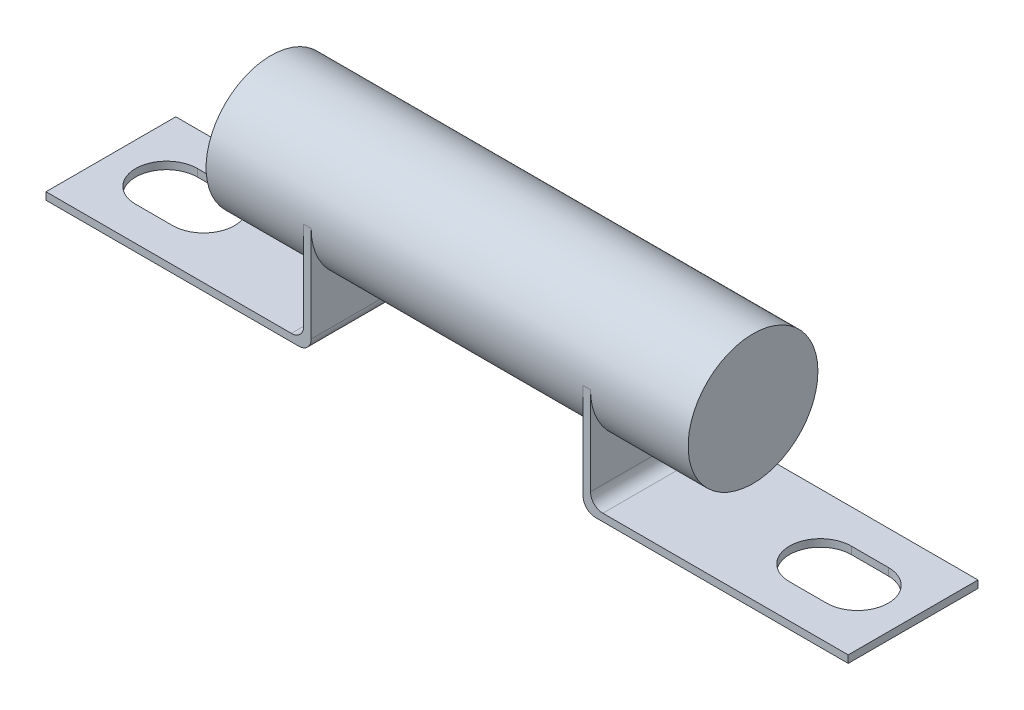
ISO-10303-21;
HEADER;
FILE_DESCRIPTION(('STEP AP214'),'2;1');
FILE_NAME('part.step','',(''),(''),'','','');
FILE_SCHEMA(('AUTOMOTIVE_DESIGN { 1 0 10303 214 1 1 1 1 }'));
ENDSEC;
DATA;
#1=APPLICATION_CONTEXT('core data for automotive mechanical design processes');
#2=APPLICATION_PROTOCOL_DEFINITION('international standard','automotive_design',2000,#1);
#3=PRODUCT_CONTEXT('',#1,'mechanical');
#4=PRODUCT('Part','Part','',(#3));
#5=PRODUCT_RELATED_PRODUCT_CATEGORY('part','',(#4));
#6=PRODUCT_DEFINITION_FORMATION('','',#4);
#7=PRODUCT_DEFINITION_CONTEXT('part definition',#1,'design');
#8=PRODUCT_DEFINITION('design','',#6,#7);
#9=PRODUCT_DEFINITION_SHAPE('','',#8);
#10=(LENGTH_UNIT() NAMED_UNIT(*) SI_UNIT(.MILLI.,.METRE.));
#11=(NAMED_UNIT(*) PLANE_ANGLE_UNIT() SI_UNIT($,.RADIAN.));
#12=(NAMED_UNIT(*) SI_UNIT($,.STERADIAN.) SOLID_ANGLE_UNIT());
#13=UNCERTAINTY_MEASURE_WITH_UNIT(LENGTH_MEASURE(1.E-05),#10,'distance_accuracy_value','');
#14=(GEOMETRIC_REPRESENTATION_CONTEXT(3) GLOBAL_UNCERTAINTY_ASSIGNED_CONTEXT((#13)) GLOBAL_UNIT_ASSIGNED_CONTEXT((#10,
#11,#12)) REPRESENTATION_CONTEXT('',''));
#15=CARTESIAN_POINT('',(0.,0.,0.));
#16=DIRECTION('',(0.,0.,1.));
#17=DIRECTION('',(1.,0.,0.));
#18=AXIS2_PLACEMENT_3D('',#15,#16,#17);
#19=CARTESIAN_POINT('',(19.5,0.,0.));
#20=DIRECTION('',(-1.,0.,0.));
#21=DIRECTION('',(0.,0.,1.));
#22=AXIS2_PLACEMENT_3D('',#19,#20,#21);
#23=CYLINDRICAL_SURFACE('',#22,5.25);
#24=DIRECTION('',(-1.,0.,0.));
#25=VECTOR('',#24,1.);
#26=CARTESIAN_POINT('',(-11.6,0.,5.25));
#27=LINE('',#26,#25);
#28=CARTESIAN_POINT('',(-11.,0.,5.25));
#29=VERTEX_POINT('',#28);
#30=CARTESIAN_POINT('',(-11.6,0.,5.25));
#31=VERTEX_POINT('',#30);
#32=EDGE_CURVE('E278',#29,#31,#27,.T.);
#33=ORIENTED_EDGE('',*,*,#32,.F.);
#34=CARTESIAN_POINT('',(-11.,0.,0.));
#35=DIRECTION('',(1.,0.,0.));
#36=DIRECTION('',(0.,1.,0.));
#37=AXIS2_PLACEMENT_3D('',#34,#35,#36);
#38=CIRCLE('',#37,5.25);
#39=CARTESIAN_POINT('',(-11.,0.,-5.25));
#40=VERTEX_POINT('',#39);
#41=EDGE_CURVE('E358',#29,#40,#38,.T.);
#42=ORIENTED_EDGE('',*,*,#41,.T.);
#43=DIRECTION('',(-1.,0.,0.));
#44=VECTOR('',#43,1.);
#45=CARTESIAN_POINT('',(-11.6,0.,-5.25));
#46=LINE('',#45,#44);
#47=CARTESIAN_POINT('',(-11.6,0.,-5.25));
#48=VERTEX_POINT('',#47);
#49=EDGE_CURVE('E302',#40,#48,#46,.T.);
#50=ORIENTED_EDGE('',*,*,#49,.T.);
#51=CARTESIAN_POINT('',(-11.6,0.,0.));
#52=DIRECTION('',(-1.,0.,0.));
#53=DIRECTION('',(0.,0.,1.));
#54=AXIS2_PLACEMENT_3D('',#51,#52,#53);
#55=CIRCLE('',#54,5.25);
#56=EDGE_CURVE('E355',#48,#31,#55,.T.);
#57=ORIENTED_EDGE('',*,*,#56,.T.);
#58=EDGE_LOOP('',(#33,#42,#50,#57));
#59=FACE_BOUND('',#58,.T.);
#60=DIRECTION('',(-1.,0.,0.));
#61=VECTOR('',#60,1.);
#62=CARTESIAN_POINT('',(11.6,0.,5.25));
#63=LINE('',#62,#61);
#64=CARTESIAN_POINT('',(11.6,0.,5.25));
#65=VERTEX_POINT('',#64);
#66=CARTESIAN_POINT('',(11.,0.,5.25));
#67=VERTEX_POINT('',#66);
#68=EDGE_CURVE('E338',#65,#67,#63,.T.);
#69=ORIENTED_EDGE('',*,*,#68,.F.);
#70=CARTESIAN_POINT('',(11.6,0.,0.));
#71=DIRECTION('',(1.,0.,0.));
#72=DIRECTION('',(0.,0.,-1.));
#73=AXIS2_PLACEMENT_3D('',#70,#71,#72);
#74=CIRCLE('',#73,5.25);
#75=CARTESIAN_POINT('',(11.6,0.,-5.25));
#76=VERTEX_POINT('',#75);
#77=EDGE_CURVE('E352',#65,#76,#74,.T.);
#78=ORIENTED_EDGE('',*,*,#77,.T.);
#79=DIRECTION('',(-1.,0.,0.));
#80=VECTOR('',#79,1.);
#81=CARTESIAN_POINT('',(11.6,0.,-5.25));
#82=LINE('',#81,#80);
#83=CARTESIAN_POINT('',(11.,0.,-5.25));
#84=VERTEX_POINT('',#83);
#85=EDGE_CURVE('E319',#76,#84,#82,.T.);
#86=ORIENTED_EDGE('',*,*,#85,.T.);
#87=CARTESIAN_POINT('',(11.,0.,0.));
#88=DIRECTION('',(-1.,0.,0.));
#89=DIRECTION('',(0.,-1.,0.));
#90=AXIS2_PLACEMENT_3D('',#87,#88,#89);
#91=CIRCLE('',#90,5.25);
#92=EDGE_CURVE('E347',#84,#67,#91,.T.);
#93=ORIENTED_EDGE('',*,*,#92,.T.);
#94=EDGE_LOOP('',(#69,#78,#86,#93));
#95=FACE_BOUND('',#94,.T.);
#96=CARTESIAN_POINT('',(19.5,0.,0.));
#97=DIRECTION('',(1.,0.,0.));
#98=DIRECTION('',(0.,0.,-1.));
#99=AXIS2_PLACEMENT_3D('',#96,#97,#98);
#100=CIRCLE('',#99,5.25);
#101=CARTESIAN_POINT('',(19.5,0.,-5.25));
#102=VERTEX_POINT('',#101);
#103=EDGE_CURVE('E344',#102,#102,#100,.T.);
#104=ORIENTED_EDGE('',*,*,#103,.F.);
#105=EDGE_LOOP('',(#104));
#106=FACE_BOUND('',#105,.T.);
#107=CARTESIAN_POINT('',(-19.5,0.,0.));
#108=DIRECTION('',(1.,0.,0.));
#109=DIRECTION('',(0.,0.,-1.));
#110=AXIS2_PLACEMENT_3D('',#107,#108,#109);
#111=CIRCLE('',#110,5.25);
#112=CARTESIAN_POINT('',(-19.5,0.,-5.25));
#113=VERTEX_POINT('',#112);
#114=EDGE_CURVE('E309',#113,#113,#111,.T.);
#115=ORIENTED_EDGE('',*,*,#114,.T.);
#116=EDGE_LOOP('',(#115));
#117=FACE_BOUND('',#116,.T.);
#118=ADVANCED_FACE('F42',(#59,#95,#106,#117),#23,.T.);
#119=CARTESIAN_POINT('',(19.5,0.,0.));
#120=DIRECTION('',(1.,0.,0.));
#121=DIRECTION('',(0.,0.,-1.));
#122=AXIS2_PLACEMENT_3D('',#119,#120,#121);
#123=PLANE('',#122);
#124=ORIENTED_EDGE('',*,*,#103,.T.);
#125=EDGE_LOOP('',(#124));
#126=FACE_BOUND('',#125,.T.);
#127=ADVANCED_FACE('F444',(#126),#123,.T.);
#128=CARTESIAN_POINT('',(-19.5,0.,0.));
#129=DIRECTION('',(1.,0.,0.));
#130=DIRECTION('',(0.,0.,-1.));
#131=AXIS2_PLACEMENT_3D('',#128,#129,#130);
#132=PLANE('',#131);
#133=ORIENTED_EDGE('',*,*,#114,.F.);
#134=EDGE_LOOP('',(#133));
#135=FACE_BOUND('',#134,.T.);
#136=ADVANCED_FACE('F450',(#135),#132,.F.);
#137=CARTESIAN_POINT('',(0.,0.,-5.25));
#138=DIRECTION('',(0.,0.,-1.));
#139=DIRECTION('',(-1.,0.,0.));
#140=AXIS2_PLACEMENT_3D('',#137,#138,#139);
#141=PLANE('',#140);
#142=DIRECTION('',(1.,0.,0.));
#143=VECTOR('',#142,1.);
#144=CARTESIAN_POINT('',(11.,-8.75,-5.25));
#145=LINE('',#144,#143);
#146=CARTESIAN_POINT('',(12.,-8.75,-5.25));
#147=VERTEX_POINT('',#146);
#148=CARTESIAN_POINT('',(32.45,-8.75,-5.25));
#149=VERTEX_POINT('',#148);
#150=EDGE_CURVE('E315',#147,#149,#145,.T.);
#151=ORIENTED_EDGE('',*,*,#150,.F.);
#152=CARTESIAN_POINT('',(12.,-7.75,-5.25));
#153=DIRECTION('',(0.,0.,-1.));
#154=DIRECTION('',(-1.,0.,0.));
#155=AXIS2_PLACEMENT_3D('',#152,#153,#154);
#156=CIRCLE('',#155,1.);
#157=CARTESIAN_POINT('',(11.,-7.75,-5.25));
#158=VERTEX_POINT('',#157);
#159=EDGE_CURVE('E368',#147,#158,#156,.T.);
#160=ORIENTED_EDGE('',*,*,#159,.T.);
#161=DIRECTION('',(0.,-1.,0.));
#162=VECTOR('',#161,1.);
#163=CARTESIAN_POINT('',(11.,0.,-5.25));
#164=LINE('',#163,#162);
#165=EDGE_CURVE('E322',#84,#158,#164,.T.);
#166=ORIENTED_EDGE('',*,*,#165,.F.);
#167=ORIENTED_EDGE('',*,*,#85,.F.);
#168=DIRECTION('',(0.,1.,0.));
#169=VECTOR('',#168,1.);
#170=CARTESIAN_POINT('',(11.6,-8.15,-5.25));
#171=LINE('',#170,#169);
#172=CARTESIAN_POINT('',(11.6,-7.15,-5.25));
#173=VERTEX_POINT('',#172);
#174=EDGE_CURVE('E316',#173,#76,#171,.T.);
#175=ORIENTED_EDGE('',*,*,#174,.F.);
#176=CARTESIAN_POINT('',(12.6,-7.15,-5.25));
#177=DIRECTION('',(0.,0.,-1.));
#178=DIRECTION('',(-1.,0.,0.));
#179=AXIS2_PLACEMENT_3D('',#176,#177,#178);
#180=CIRCLE('',#179,1.);
#181=CARTESIAN_POINT('',(12.6,-8.15,-5.25));
#182=VERTEX_POINT('',#181);
#183=EDGE_CURVE('E391',#173,#182,#180,.F.);
#184=ORIENTED_EDGE('',*,*,#183,.T.);
#185=DIRECTION('',(-1.,0.,0.));
#186=VECTOR('',#185,1.);
#187=CARTESIAN_POINT('',(32.45,-8.15,-5.25));
#188=LINE('',#187,#186);
#189=CARTESIAN_POINT('',(32.45,-8.15,-5.25));
#190=VERTEX_POINT('',#189);
#191=EDGE_CURVE('E318',#190,#182,#188,.T.);
#192=ORIENTED_EDGE('',*,*,#191,.F.);
#193=DIRECTION('',(0.,1.,0.));
#194=VECTOR('',#193,1.);
#195=CARTESIAN_POINT('',(32.45,-8.75,-5.25));
#196=LINE('',#195,#194);
#197=EDGE_CURVE('E311',#149,#190,#196,.T.);
#198=ORIENTED_EDGE('',*,*,#197,.F.);
#199=EDGE_LOOP('',(#151,#160,#166,#167,#175,#184,#192,#198));
#200=FACE_BOUND('',#199,.T.);
#201=ADVANCED_FACE('F505',(#200),#141,.T.);
#202=CARTESIAN_POINT('',(0.,0.,5.25));
#203=DIRECTION('',(0.,0.,1.));
#204=DIRECTION('',(1.,0.,0.));
#205=AXIS2_PLACEMENT_3D('',#202,#203,#204);
#206=PLANE('',#205);
#207=DIRECTION('',(0.,-1.,0.));
#208=VECTOR('',#207,1.);
#209=CARTESIAN_POINT('',(11.,0.,5.25));
#210=LINE('',#209,#208);
#211=CARTESIAN_POINT('',(11.,-7.75,5.25));
#212=VERTEX_POINT('',#211);
#213=EDGE_CURVE('E340',#67,#212,#210,.T.);
#214=ORIENTED_EDGE('',*,*,#213,.T.);
#215=CARTESIAN_POINT('',(12.,-7.75,5.25));
#216=DIRECTION('',(0.,0.,1.));
#217=DIRECTION('',(1.,0.,0.));
#218=AXIS2_PLACEMENT_3D('',#215,#216,#217);
#219=CIRCLE('',#218,1.);
#220=CARTESIAN_POINT('',(12.,-8.75,5.25));
#221=VERTEX_POINT('',#220);
#222=EDGE_CURVE('E364',#212,#221,#219,.T.);
#223=ORIENTED_EDGE('',*,*,#222,.T.);
#224=DIRECTION('',(1.,0.,0.));
#225=VECTOR('',#224,1.);
#226=CARTESIAN_POINT('',(11.,-8.75,5.25));
#227=LINE('',#226,#225);
#228=CARTESIAN_POINT('',(32.45,-8.75,5.25));
#229=VERTEX_POINT('',#228);
#230=EDGE_CURVE('E330',#221,#229,#227,.T.);
#231=ORIENTED_EDGE('',*,*,#230,.T.);
#232=DIRECTION('',(0.,1.,0.));
#233=VECTOR('',#232,1.);
#234=CARTESIAN_POINT('',(32.45,-8.75,5.25));
#235=LINE('',#234,#233);
#236=CARTESIAN_POINT('',(32.45,-8.15,5.25));
#237=VERTEX_POINT('',#236);
#238=EDGE_CURVE('E288',#229,#237,#235,.T.);
#239=ORIENTED_EDGE('',*,*,#238,.T.);
#240=DIRECTION('',(-1.,0.,0.));
#241=VECTOR('',#240,1.);
#242=CARTESIAN_POINT('',(32.45,-8.15,5.25));
#243=LINE('',#242,#241);
#244=CARTESIAN_POINT('',(12.6,-8.15,5.25));
#245=VERTEX_POINT('',#244);
#246=EDGE_CURVE('E333',#237,#245,#243,.T.);
#247=ORIENTED_EDGE('',*,*,#246,.T.);
#248=CARTESIAN_POINT('',(12.6,-7.15,5.25));
#249=DIRECTION('',(0.,0.,1.));
#250=DIRECTION('',(1.,0.,0.));
#251=AXIS2_PLACEMENT_3D('',#248,#249,#250);
#252=CIRCLE('',#251,1.);
#253=CARTESIAN_POINT('',(11.6,-7.15,5.25));
#254=VERTEX_POINT('',#253);
#255=EDGE_CURVE('E389',#245,#254,#252,.F.);
#256=ORIENTED_EDGE('',*,*,#255,.T.);
#257=DIRECTION('',(0.,1.,0.));
#258=VECTOR('',#257,1.);
#259=CARTESIAN_POINT('',(11.6,-8.15,5.25));
#260=LINE('',#259,#258);
#261=EDGE_CURVE('E336',#254,#65,#260,.T.);
#262=ORIENTED_EDGE('',*,*,#261,.T.);
#263=ORIENTED_EDGE('',*,*,#68,.T.);
#264=EDGE_LOOP('',(#214,#223,#231,#239,#247,#256,#262,#263));
#265=FACE_BOUND('',#264,.T.);
#266=ADVANCED_FACE('F507',(#265),#206,.T.);
#267=CARTESIAN_POINT('',(32.45,-8.15,-28.4160311663435));
#268=DIRECTION('',(0.,1.,0.));
#269=DIRECTION('',(-1.,0.,0.));
#270=AXIS2_PLACEMENT_3D('',#267,#268,#269);
#271=PLANE('',#270);
#272=DIRECTION('',(1.,0.,0.));
#273=VECTOR('',#272,1.);
#274=CARTESIAN_POINT('',(24.95,-8.15,2.49999999999999));
#275=LINE('',#274,#273);
#276=CARTESIAN_POINT('',(24.95,-8.15,2.49999999999999));
#277=VERTEX_POINT('',#276);
#278=CARTESIAN_POINT('',(27.95,-8.15,2.49999999999999));
#279=VERTEX_POINT('',#278);
#280=EDGE_CURVE('E265',#277,#279,#275,.T.);
#281=ORIENTED_EDGE('',*,*,#280,.F.);
#282=CARTESIAN_POINT('',(24.95,-8.15,0.));
#283=DIRECTION('',(0.,1.,0.));
#284=DIRECTION('',(1.,0.,0.));
#285=AXIS2_PLACEMENT_3D('',#282,#283,#284);
#286=CIRCLE('',#285,2.5);
#287=CARTESIAN_POINT('',(24.95,-8.15,-2.5));
#288=VERTEX_POINT('',#287);
#289=EDGE_CURVE('E263',#288,#277,#286,.T.);
#290=ORIENTED_EDGE('',*,*,#289,.F.);
#291=DIRECTION('',(-1.,0.,0.));
#292=VECTOR('',#291,1.);
#293=CARTESIAN_POINT('',(24.95,-8.15,-2.50000000000001));
#294=LINE('',#293,#292);
#295=CARTESIAN_POINT('',(27.95,-8.15,-2.5));
#296=VERTEX_POINT('',#295);
#297=EDGE_CURVE('E57',#296,#288,#294,.T.);
#298=ORIENTED_EDGE('',*,*,#297,.F.);
#299=CARTESIAN_POINT('',(27.95,-8.15,0.));
#300=DIRECTION('',(0.,1.,0.));
#301=DIRECTION('',(1.,0.,0.));
#302=AXIS2_PLACEMENT_3D('',#299,#300,#301);
#303=CIRCLE('',#302,2.5);
#304=EDGE_CURVE('E268',#279,#296,#303,.T.);
#305=ORIENTED_EDGE('',*,*,#304,.F.);
#306=EDGE_LOOP('',(#281,#290,#298,#305));
#307=FACE_BOUND('',#306,.T.);
#308=ORIENTED_EDGE('',*,*,#191,.T.);
#309=DIRECTION('',(0.,0.,1.));
#310=VECTOR('',#309,1.);
#311=CARTESIAN_POINT('',(12.6,-8.15,5.25));
#312=LINE('',#311,#310);
#313=EDGE_CURVE('E370',#182,#245,#312,.T.);
#314=ORIENTED_EDGE('',*,*,#313,.T.);
#315=ORIENTED_EDGE('',*,*,#246,.F.);
#316=DIRECTION('',(0.,0.,1.));
#317=VECTOR('',#316,1.);
#318=CARTESIAN_POINT('',(32.45,-8.15,-28.4160311663435));
#319=LINE('',#318,#317);
#320=EDGE_CURVE('E243',#190,#237,#319,.T.);
#321=ORIENTED_EDGE('',*,*,#320,.F.);
#322=EDGE_LOOP('',(#308,#314,#315,#321));
#323=FACE_BOUND('',#322,.T.);
#324=ADVANCED_FACE('F509',(#307,#323),#271,.T.);
#325=CARTESIAN_POINT('',(11.6,-8.15,-28.4160311663435));
#326=DIRECTION('',(1.,0.,0.));
#327=DIRECTION('',(0.,0.,-1.));
#328=AXIS2_PLACEMENT_3D('',#325,#326,#327);
#329=PLANE('',#328);
#330=ORIENTED_EDGE('',*,*,#261,.F.);
#331=DIRECTION('',(0.,0.,1.));
#332=VECTOR('',#331,1.);
#333=CARTESIAN_POINT('',(11.6,-7.15,-5.25));
#334=LINE('',#333,#332);
#335=EDGE_CURVE('E373',#254,#173,#334,.F.);
#336=ORIENTED_EDGE('',*,*,#335,.T.);
#337=ORIENTED_EDGE('',*,*,#174,.T.);
#338=ORIENTED_EDGE('',*,*,#77,.F.);
#339=EDGE_LOOP('',(#330,#336,#337,#338));
#340=FACE_BOUND('',#339,.T.);
#341=ADVANCED_FACE('F511',(#340),#329,.T.);
#342=CARTESIAN_POINT('',(11.,0.,-28.4160311663435));
#343=DIRECTION('',(-1.,0.,0.));
#344=DIRECTION('',(0.,-1.,0.));
#345=AXIS2_PLACEMENT_3D('',#342,#343,#344);
#346=PLANE('',#345);
#347=ORIENTED_EDGE('',*,*,#165,.T.);
#348=DIRECTION('',(0.,0.,1.));
#349=VECTOR('',#348,1.);
#350=CARTESIAN_POINT('',(11.,-7.75,-28.4160311663435));
#351=LINE('',#350,#349);
#352=EDGE_CURVE('E361',#158,#212,#351,.T.);
#353=ORIENTED_EDGE('',*,*,#352,.T.);
#354=ORIENTED_EDGE('',*,*,#213,.F.);
#355=ORIENTED_EDGE('',*,*,#92,.F.);
#356=EDGE_LOOP('',(#347,#353,#354,#355));
#357=FACE_BOUND('',#356,.T.);
#358=ADVANCED_FACE('F515',(#357),#346,.T.);
#359=CARTESIAN_POINT('',(11.,-8.75,-28.4160311663435));
#360=DIRECTION('',(0.,-1.,0.));
#361=DIRECTION('',(1.,0.,0.));
#362=AXIS2_PLACEMENT_3D('',#359,#360,#361);
#363=PLANE('',#362);
#364=DIRECTION('',(1.,0.,0.));
#365=VECTOR('',#364,1.);
#366=CARTESIAN_POINT('',(24.95,-8.75,2.49999999999999));
#367=LINE('',#366,#365);
#368=CARTESIAN_POINT('',(24.95,-8.75,2.5));
#369=VERTEX_POINT('',#368);
#370=CARTESIAN_POINT('',(27.95,-8.75,2.49999999999999));
#371=VERTEX_POINT('',#370);
#372=EDGE_CURVE('E248',#369,#371,#367,.T.);
#373=ORIENTED_EDGE('',*,*,#372,.T.);
#374=CARTESIAN_POINT('',(27.95,-8.74999999999999,0.));
#375=DIRECTION('',(0.,-1.,0.));
#376=DIRECTION('',(1.,0.,0.));
#377=AXIS2_PLACEMENT_3D('',#374,#375,#376);
#378=CIRCLE('',#377,2.5);
#379=CARTESIAN_POINT('',(27.95,-8.74999999999999,-2.5));
#380=VERTEX_POINT('',#379);
#381=EDGE_CURVE('E249',#371,#380,#378,.F.);
#382=ORIENTED_EDGE('',*,*,#381,.T.);
#383=DIRECTION('',(-1.,0.,0.));
#384=VECTOR('',#383,1.);
#385=CARTESIAN_POINT('',(24.95,-8.75,-2.50000000000001));
#386=LINE('',#385,#384);
#387=CARTESIAN_POINT('',(24.95,-8.75,-2.50000000000001));
#388=VERTEX_POINT('',#387);
#389=EDGE_CURVE('E252',#380,#388,#386,.T.);
#390=ORIENTED_EDGE('',*,*,#389,.T.);
#391=CARTESIAN_POINT('',(24.95,-8.75,0.));
#392=DIRECTION('',(0.,-1.,0.));
#393=DIRECTION('',(1.,0.,0.));
#394=AXIS2_PLACEMENT_3D('',#391,#392,#393);
#395=CIRCLE('',#394,2.5);
#396=EDGE_CURVE('E245',#388,#369,#395,.F.);
#397=ORIENTED_EDGE('',*,*,#396,.T.);
#398=EDGE_LOOP('',(#373,#382,#390,#397));
#399=FACE_BOUND('',#398,.T.);
#400=ORIENTED_EDGE('',*,*,#230,.F.);
#401=DIRECTION('',(0.,0.,1.));
#402=VECTOR('',#401,1.);
#403=CARTESIAN_POINT('',(12.,-8.75,-28.4160311663435));
#404=LINE('',#403,#402);
#405=EDGE_CURVE('E366',#221,#147,#404,.F.);
#406=ORIENTED_EDGE('',*,*,#405,.T.);
#407=ORIENTED_EDGE('',*,*,#150,.T.);
#408=DIRECTION('',(0.,0.,1.));
#409=VECTOR('',#408,1.);
#410=CARTESIAN_POINT('',(32.45,-8.75,-28.4160311663435));
#411=LINE('',#410,#409);
#412=EDGE_CURVE('E312',#149,#229,#411,.T.);
#413=ORIENTED_EDGE('',*,*,#412,.T.);
#414=EDGE_LOOP('',(#400,#406,#407,#413));
#415=FACE_BOUND('',#414,.T.);
#416=ADVANCED_FACE('F500',(#399,#415),#363,.T.);
#417=CARTESIAN_POINT('',(32.45,-8.75,-28.4160311663435));
#418=DIRECTION('',(1.,0.,0.));
#419=DIRECTION('',(0.,0.,-1.));
#420=AXIS2_PLACEMENT_3D('',#417,#418,#419);
#421=PLANE('',#420);
#422=ORIENTED_EDGE('',*,*,#412,.F.);
#423=ORIENTED_EDGE('',*,*,#197,.T.);
#424=ORIENTED_EDGE('',*,*,#320,.T.);
#425=ORIENTED_EDGE('',*,*,#238,.F.);
#426=EDGE_LOOP('',(#422,#423,#424,#425));
#427=FACE_BOUND('',#426,.T.);
#428=ADVANCED_FACE('F495',(#427),#421,.T.);
#429=CARTESIAN_POINT('',(0.,0.,-5.25));
#430=DIRECTION('',(0.,0.,-1.));
#431=DIRECTION('',(-1.,0.,0.));
#432=AXIS2_PLACEMENT_3D('',#429,#430,#431);
#433=PLANE('',#432);
#434=DIRECTION('',(0.,1.,0.));
#435=VECTOR('',#434,1.);
#436=CARTESIAN_POINT('',(-11.,0.,-5.25));
#437=LINE('',#436,#435);
#438=CARTESIAN_POINT('',(-11.,-7.75,-5.25));
#439=VERTEX_POINT('',#438);
#440=EDGE_CURVE('E291',#439,#40,#437,.T.);
#441=ORIENTED_EDGE('',*,*,#440,.F.);
#442=CARTESIAN_POINT('',(-12.,-7.75,-5.25));
#443=DIRECTION('',(0.,0.,-1.));
#444=DIRECTION('',(-1.,0.,0.));
#445=AXIS2_PLACEMENT_3D('',#442,#443,#444);
#446=CIRCLE('',#445,1.);
#447=CARTESIAN_POINT('',(-12.,-8.75,-5.25));
#448=VERTEX_POINT('',#447);
#449=EDGE_CURVE('E382',#439,#448,#446,.T.);
#450=ORIENTED_EDGE('',*,*,#449,.T.);
#451=DIRECTION('',(1.,0.,0.));
#452=VECTOR('',#451,1.);
#453=CARTESIAN_POINT('',(-11.,-8.75,-5.25));
#454=LINE('',#453,#452);
#455=CARTESIAN_POINT('',(-32.45,-8.75,-5.25));
#456=VERTEX_POINT('',#455);
#457=EDGE_CURVE('E274',#456,#448,#454,.T.);
#458=ORIENTED_EDGE('',*,*,#457,.F.);
#459=DIRECTION('',(0.,-1.,0.));
#460=VECTOR('',#459,1.);
#461=CARTESIAN_POINT('',(-32.45,-8.75,-5.25));
#462=LINE('',#461,#460);
#463=CARTESIAN_POINT('',(-32.45,-8.15,-5.25));
#464=VERTEX_POINT('',#463);
#465=EDGE_CURVE('E292',#464,#456,#462,.T.);
#466=ORIENTED_EDGE('',*,*,#465,.F.);
#467=DIRECTION('',(-1.,0.,0.));
#468=VECTOR('',#467,1.);
#469=CARTESIAN_POINT('',(-32.45,-8.15,-5.25));
#470=LINE('',#469,#468);
#471=CARTESIAN_POINT('',(-12.6,-8.15,-5.25));
#472=VERTEX_POINT('',#471);
#473=EDGE_CURVE('E297',#472,#464,#470,.T.);
#474=ORIENTED_EDGE('',*,*,#473,.F.);
#475=CARTESIAN_POINT('',(-12.6,-7.15,-5.25));
#476=DIRECTION('',(0.,0.,-1.));
#477=DIRECTION('',(-1.,0.,0.));
#478=AXIS2_PLACEMENT_3D('',#475,#476,#477);
#479=CIRCLE('',#478,1.);
#480=CARTESIAN_POINT('',(-11.6,-7.15,-5.25));
#481=VERTEX_POINT('',#480);
#482=EDGE_CURVE('E11',#472,#481,#479,.F.);
#483=ORIENTED_EDGE('',*,*,#482,.T.);
#484=DIRECTION('',(0.,-1.,0.));
#485=VECTOR('',#484,1.);
#486=CARTESIAN_POINT('',(-11.6,-8.15,-5.25));
#487=LINE('',#486,#485);
#488=EDGE_CURVE('E299',#48,#481,#487,.T.);
#489=ORIENTED_EDGE('',*,*,#488,.F.);
#490=ORIENTED_EDGE('',*,*,#49,.F.);
#491=EDGE_LOOP('',(#441,#450,#458,#466,#474,#483,#489,#490));
#492=FACE_BOUND('',#491,.T.);
#493=ADVANCED_FACE('F408',(#492),#433,.T.);
#494=CARTESIAN_POINT('',(0.,0.,5.25));
#495=DIRECTION('',(0.,0.,-1.));
#496=DIRECTION('',(-1.,0.,0.));
#497=AXIS2_PLACEMENT_3D('',#494,#495,#496);
#498=PLANE('',#497);
#499=DIRECTION('',(1.,0.,0.));
#500=VECTOR('',#499,1.);
#501=CARTESIAN_POINT('',(-11.,-8.75,5.25));
#502=LINE('',#501,#500);
#503=CARTESIAN_POINT('',(-32.45,-8.75,5.25));
#504=VERTEX_POINT('',#503);
#505=CARTESIAN_POINT('',(-12.,-8.75,5.25));
#506=VERTEX_POINT('',#505);
#507=EDGE_CURVE('E282',#504,#506,#502,.T.);
#508=ORIENTED_EDGE('',*,*,#507,.T.);
#509=CARTESIAN_POINT('',(-12.,-7.75,5.25));
#510=DIRECTION('',(0.,0.,-1.));
#511=DIRECTION('',(-1.,0.,0.));
#512=AXIS2_PLACEMENT_3D('',#509,#510,#511);
#513=CIRCLE('',#512,1.);
#514=CARTESIAN_POINT('',(-11.,-7.75,5.25));
#515=VERTEX_POINT('',#514);
#516=EDGE_CURVE('E378',#506,#515,#513,.F.);
#517=ORIENTED_EDGE('',*,*,#516,.T.);
#518=DIRECTION('',(0.,1.,0.));
#519=VECTOR('',#518,1.);
#520=CARTESIAN_POINT('',(-11.,0.,5.25));
#521=LINE('',#520,#519);
#522=EDGE_CURVE('E280',#515,#29,#521,.T.);
#523=ORIENTED_EDGE('',*,*,#522,.T.);
#524=ORIENTED_EDGE('',*,*,#32,.T.);
#525=DIRECTION('',(0.,-1.,0.));
#526=VECTOR('',#525,1.);
#527=CARTESIAN_POINT('',(-11.6,-8.15,5.25));
#528=LINE('',#527,#526);
#529=CARTESIAN_POINT('',(-11.6,-7.15,5.25));
#530=VERTEX_POINT('',#529);
#531=EDGE_CURVE('E275',#31,#530,#528,.T.);
#532=ORIENTED_EDGE('',*,*,#531,.T.);
#533=CARTESIAN_POINT('',(-12.6,-7.15,5.25));
#534=DIRECTION('',(0.,0.,-1.));
#535=DIRECTION('',(-1.,0.,0.));
#536=AXIS2_PLACEMENT_3D('',#533,#534,#535);
#537=CIRCLE('',#536,1.);
#538=CARTESIAN_POINT('',(-12.6,-8.15,5.25));
#539=VERTEX_POINT('',#538);
#540=EDGE_CURVE('E50',#530,#539,#537,.T.);
#541=ORIENTED_EDGE('',*,*,#540,.T.);
#542=DIRECTION('',(-1.,0.,0.));
#543=VECTOR('',#542,1.);
#544=CARTESIAN_POINT('',(-32.45,-8.15,5.25));
#545=LINE('',#544,#543);
#546=CARTESIAN_POINT('',(-32.45,-8.15,5.25));
#547=VERTEX_POINT('',#546);
#548=EDGE_CURVE('E272',#539,#547,#545,.T.);
#549=ORIENTED_EDGE('',*,*,#548,.T.);
#550=DIRECTION('',(0.,-1.,0.));
#551=VECTOR('',#550,1.);
#552=CARTESIAN_POINT('',(-32.45,-8.75,5.25));
#553=LINE('',#552,#551);
#554=EDGE_CURVE('E285',#547,#504,#553,.T.);
#555=ORIENTED_EDGE('',*,*,#554,.T.);
#556=EDGE_LOOP('',(#508,#517,#523,#524,#532,#541,#549,#555));
#557=FACE_BOUND('',#556,.T.);
#558=ADVANCED_FACE('F394',(#557),#498,.F.);
#559=CARTESIAN_POINT('',(-11.,-8.75,-28.4160311663435));
#560=DIRECTION('',(0.,-1.,0.));
#561=DIRECTION('',(1.,0.,0.));
#562=AXIS2_PLACEMENT_3D('',#559,#560,#561);
#563=PLANE('',#562);
#564=DIRECTION('',(-1.,0.,0.));
#565=VECTOR('',#564,1.);
#566=CARTESIAN_POINT('',(-24.95,-8.75,-2.50000000000001));
#567=LINE('',#566,#565);
#568=CARTESIAN_POINT('',(-24.95,-8.75,-2.5));
#569=VERTEX_POINT('',#568);
#570=CARTESIAN_POINT('',(-27.95,-8.75000000000001,-2.5));
#571=VERTEX_POINT('',#570);
#572=EDGE_CURVE('E217',#569,#571,#567,.T.);
#573=ORIENTED_EDGE('',*,*,#572,.T.);
#574=CARTESIAN_POINT('',(-27.95,-8.75,0.));
#575=DIRECTION('',(0.,-1.,0.));
#576=DIRECTION('',(1.,0.,0.));
#577=AXIS2_PLACEMENT_3D('',#574,#575,#576);
#578=CIRCLE('',#577,2.5);
#579=CARTESIAN_POINT('',(-27.95,-8.75,2.5));
#580=VERTEX_POINT('',#579);
#581=EDGE_CURVE('E203',#571,#580,#578,.F.);
#582=ORIENTED_EDGE('',*,*,#581,.T.);
#583=DIRECTION('',(1.,0.,0.));
#584=VECTOR('',#583,1.);
#585=CARTESIAN_POINT('',(-24.95,-8.75,2.49999999999999));
#586=LINE('',#585,#584);
#587=CARTESIAN_POINT('',(-24.95,-8.75,2.49999999999999));
#588=VERTEX_POINT('',#587);
#589=EDGE_CURVE('E237',#580,#588,#586,.T.);
#590=ORIENTED_EDGE('',*,*,#589,.T.);
#591=CARTESIAN_POINT('',(-24.95,-8.75,0.));
#592=DIRECTION('',(0.,-1.,0.));
#593=DIRECTION('',(1.,0.,0.));
#594=AXIS2_PLACEMENT_3D('',#591,#592,#593);
#595=CIRCLE('',#594,2.5);
#596=EDGE_CURVE('E225',#588,#569,#595,.F.);
#597=ORIENTED_EDGE('',*,*,#596,.T.);
#598=EDGE_LOOP('',(#573,#582,#590,#597));
#599=FACE_BOUND('',#598,.T.);
#600=ORIENTED_EDGE('',*,*,#457,.T.);
#601=DIRECTION('',(0.,0.,1.));
#602=VECTOR('',#601,1.);
#603=CARTESIAN_POINT('',(-12.,-8.75,-28.4160311663435));
#604=LINE('',#603,#602);
#605=EDGE_CURVE('E375',#448,#506,#604,.T.);
#606=ORIENTED_EDGE('',*,*,#605,.T.);
#607=ORIENTED_EDGE('',*,*,#507,.F.);
#608=DIRECTION('',(0.,0.,1.));
#609=VECTOR('',#608,1.);
#610=CARTESIAN_POINT('',(-32.45,-8.75,-28.4160311663435));
#611=LINE('',#610,#609);
#612=EDGE_CURVE('E295',#456,#504,#611,.T.);
#613=ORIENTED_EDGE('',*,*,#612,.F.);
#614=EDGE_LOOP('',(#600,#606,#607,#613));
#615=FACE_BOUND('',#614,.T.);
#616=ADVANCED_FACE('F223',(#599,#615),#563,.T.);
#617=CARTESIAN_POINT('',(-11.,0.,-28.4160311663435));
#618=DIRECTION('',(1.,0.,0.));
#619=DIRECTION('',(0.,1.,0.));
#620=AXIS2_PLACEMENT_3D('',#617,#618,#619);
#621=PLANE('',#620);
#622=ORIENTED_EDGE('',*,*,#522,.F.);
#623=DIRECTION('',(0.,0.,1.));
#624=VECTOR('',#623,1.);
#625=CARTESIAN_POINT('',(-11.,-7.75,-28.4160311663435));
#626=LINE('',#625,#624);
#627=EDGE_CURVE('E380',#515,#439,#626,.F.);
#628=ORIENTED_EDGE('',*,*,#627,.T.);
#629=ORIENTED_EDGE('',*,*,#440,.T.);
#630=ORIENTED_EDGE('',*,*,#41,.F.);
#631=EDGE_LOOP('',(#622,#628,#629,#630));
#632=FACE_BOUND('',#631,.T.);
#633=ADVANCED_FACE('F493',(#632),#621,.T.);
#634=CARTESIAN_POINT('',(-11.6,-8.15,-28.4160311663435));
#635=DIRECTION('',(-1.,0.,0.));
#636=DIRECTION('',(0.,0.,1.));
#637=AXIS2_PLACEMENT_3D('',#634,#635,#636);
#638=PLANE('',#637);
#639=ORIENTED_EDGE('',*,*,#488,.T.);
#640=DIRECTION('',(0.,0.,1.));
#641=VECTOR('',#640,1.);
#642=CARTESIAN_POINT('',(-11.6,-7.15,5.25));
#643=LINE('',#642,#641);
#644=EDGE_CURVE('E384',#481,#530,#643,.T.);
#645=ORIENTED_EDGE('',*,*,#644,.T.);
#646=ORIENTED_EDGE('',*,*,#531,.F.);
#647=ORIENTED_EDGE('',*,*,#56,.F.);
#648=EDGE_LOOP('',(#639,#645,#646,#647));
#649=FACE_BOUND('',#648,.T.);
#650=ADVANCED_FACE('F412',(#649),#638,.T.);
#651=CARTESIAN_POINT('',(-32.45,-8.15,-28.4160311663435));
#652=DIRECTION('',(0.,1.,0.));
#653=DIRECTION('',(-1.,0.,0.));
#654=AXIS2_PLACEMENT_3D('',#651,#652,#653);
#655=PLANE('',#654);
#656=DIRECTION('',(-1.,0.,0.));
#657=VECTOR('',#656,1.);
#658=CARTESIAN_POINT('',(-24.95,-8.15,-2.50000000000001));
#659=LINE('',#658,#657);
#660=CARTESIAN_POINT('',(-24.95,-8.15,-2.50000000000001));
#661=VERTEX_POINT('',#660);
#662=CARTESIAN_POINT('',(-27.95,-8.15,-2.5));
#663=VERTEX_POINT('',#662);
#664=EDGE_CURVE('E220',#661,#663,#659,.T.);
#665=ORIENTED_EDGE('',*,*,#664,.F.);
#666=CARTESIAN_POINT('',(-24.95,-8.15,0.));
#667=DIRECTION('',(0.,1.,0.));
#668=DIRECTION('',(-1.,0.,0.));
#669=AXIS2_PLACEMENT_3D('',#666,#667,#668);
#670=CIRCLE('',#669,2.5);
#671=CARTESIAN_POINT('',(-24.95,-8.15,2.5));
#672=VERTEX_POINT('',#671);
#673=EDGE_CURVE('E232',#672,#661,#670,.T.);
#674=ORIENTED_EDGE('',*,*,#673,.F.);
#675=DIRECTION('',(1.,0.,0.));
#676=VECTOR('',#675,1.);
#677=CARTESIAN_POINT('',(-24.95,-8.15,2.49999999999999));
#678=LINE('',#677,#676);
#679=CARTESIAN_POINT('',(-27.95,-8.15,2.49999999999999));
#680=VERTEX_POINT('',#679);
#681=EDGE_CURVE('E226',#680,#672,#678,.T.);
#682=ORIENTED_EDGE('',*,*,#681,.F.);
#683=CARTESIAN_POINT('',(-27.95,-8.15,0.));
#684=DIRECTION('',(0.,1.,0.));
#685=DIRECTION('',(-1.,0.,0.));
#686=AXIS2_PLACEMENT_3D('',#683,#684,#685);
#687=CIRCLE('',#686,2.5);
#688=EDGE_CURVE('E228',#663,#680,#687,.T.);
#689=ORIENTED_EDGE('',*,*,#688,.F.);
#690=EDGE_LOOP('',(#665,#674,#682,#689));
#691=FACE_BOUND('',#690,.T.);
#692=ORIENTED_EDGE('',*,*,#548,.F.);
#693=DIRECTION('',(0.,0.,1.));
#694=VECTOR('',#693,1.);
#695=CARTESIAN_POINT('',(-12.6,-8.15,-5.25));
#696=LINE('',#695,#694);
#697=EDGE_CURVE('E387',#539,#472,#696,.F.);
#698=ORIENTED_EDGE('',*,*,#697,.T.);
#699=ORIENTED_EDGE('',*,*,#473,.T.);
#700=DIRECTION('',(0.,0.,1.));
#701=VECTOR('',#700,1.);
#702=CARTESIAN_POINT('',(-32.45,-8.15,-28.4160311663435));
#703=LINE('',#702,#701);
#704=EDGE_CURVE('E296',#464,#547,#703,.T.);
#705=ORIENTED_EDGE('',*,*,#704,.T.);
#706=EDGE_LOOP('',(#692,#698,#699,#705));
#707=FACE_BOUND('',#706,.T.);
#708=ADVANCED_FACE('F400',(#691,#707),#655,.T.);
#709=CARTESIAN_POINT('',(-32.45,-8.75,-28.4160311663435));
#710=DIRECTION('',(-1.,0.,0.));
#711=DIRECTION('',(0.,0.,1.));
#712=AXIS2_PLACEMENT_3D('',#709,#710,#711);
#713=PLANE('',#712);
#714=ORIENTED_EDGE('',*,*,#704,.F.);
#715=ORIENTED_EDGE('',*,*,#465,.T.);
#716=ORIENTED_EDGE('',*,*,#612,.T.);
#717=ORIENTED_EDGE('',*,*,#554,.F.);
#718=EDGE_LOOP('',(#714,#715,#716,#717));
#719=FACE_BOUND('',#718,.T.);
#720=ADVANCED_FACE('F427',(#719),#713,.T.);
#721=CARTESIAN_POINT('',(12.,-7.75,-28.4160311663435));
#722=DIRECTION('',(0.,0.,1.));
#723=DIRECTION('',(1.,0.,0.));
#724=AXIS2_PLACEMENT_3D('',#721,#722,#723);
#725=CYLINDRICAL_SURFACE('',#724,1.);
#726=ORIENTED_EDGE('',*,*,#159,.F.);
#727=ORIENTED_EDGE('',*,*,#405,.F.);
#728=ORIENTED_EDGE('',*,*,#222,.F.);
#729=ORIENTED_EDGE('',*,*,#352,.F.);
#730=EDGE_LOOP('',(#726,#727,#728,#729));
#731=FACE_BOUND('',#730,.T.);
#732=ADVANCED_FACE('F429',(#731),#725,.T.);
#733=CARTESIAN_POINT('',(12.6,-7.15,-28.4160311663435));
#734=DIRECTION('',(0.,0.,-1.));
#735=DIRECTION('',(-1.,0.,0.));
#736=AXIS2_PLACEMENT_3D('',#733,#734,#735);
#737=CYLINDRICAL_SURFACE('',#736,1.);
#738=ORIENTED_EDGE('',*,*,#183,.F.);
#739=ORIENTED_EDGE('',*,*,#335,.F.);
#740=ORIENTED_EDGE('',*,*,#255,.F.);
#741=ORIENTED_EDGE('',*,*,#313,.F.);
#742=EDGE_LOOP('',(#738,#739,#740,#741));
#743=FACE_BOUND('',#742,.T.);
#744=ADVANCED_FACE('F436',(#743),#737,.F.);
#745=CARTESIAN_POINT('',(-12.,-7.75,-28.4160311663435));
#746=DIRECTION('',(0.,0.,1.));
#747=DIRECTION('',(1.,0.,0.));
#748=AXIS2_PLACEMENT_3D('',#745,#746,#747);
#749=CYLINDRICAL_SURFACE('',#748,1.);
#750=ORIENTED_EDGE('',*,*,#449,.F.);
#751=ORIENTED_EDGE('',*,*,#627,.F.);
#752=ORIENTED_EDGE('',*,*,#516,.F.);
#753=ORIENTED_EDGE('',*,*,#605,.F.);
#754=EDGE_LOOP('',(#750,#751,#752,#753));
#755=FACE_BOUND('',#754,.T.);
#756=ADVANCED_FACE('F422',(#755),#749,.T.);
#757=CARTESIAN_POINT('',(-12.6,-7.15,-28.4160311663435));
#758=DIRECTION('',(0.,0.,-1.));
#759=DIRECTION('',(-1.,0.,0.));
#760=AXIS2_PLACEMENT_3D('',#757,#758,#759);
#761=CYLINDRICAL_SURFACE('',#760,1.);
#762=ORIENTED_EDGE('',*,*,#482,.F.);
#763=ORIENTED_EDGE('',*,*,#697,.F.);
#764=ORIENTED_EDGE('',*,*,#540,.F.);
#765=ORIENTED_EDGE('',*,*,#644,.F.);
#766=EDGE_LOOP('',(#762,#763,#764,#765));
#767=FACE_BOUND('',#766,.T.);
#768=ADVANCED_FACE('F44',(#767),#761,.F.);
#769=CARTESIAN_POINT('',(-24.95,-18.1839811320566,-2.50000000000001));
#770=DIRECTION('',(0.,0.,-1.));
#771=DIRECTION('',(-1.,0.,0.));
#772=AXIS2_PLACEMENT_3D('',#769,#770,#771);
#773=PLANE('',#772);
#774=DIRECTION('',(0.,1.,0.));
#775=VECTOR('',#774,1.);
#776=CARTESIAN_POINT('',(-24.95,-18.1839811320566,-2.50000000000001));
#777=LINE('',#776,#775);
#778=EDGE_CURVE('E235',#569,#661,#777,.T.);
#779=ORIENTED_EDGE('',*,*,#778,.T.);
#780=ORIENTED_EDGE('',*,*,#664,.T.);
#781=DIRECTION('',(0.,1.,0.));
#782=VECTOR('',#781,1.);
#783=CARTESIAN_POINT('',(-27.95,-18.1839811320566,-2.5));
#784=LINE('',#783,#782);
#785=EDGE_CURVE('E207',#571,#663,#784,.T.);
#786=ORIENTED_EDGE('',*,*,#785,.F.);
#787=ORIENTED_EDGE('',*,*,#572,.F.);
#788=EDGE_LOOP('',(#779,#780,#786,#787));
#789=FACE_BOUND('',#788,.T.);
#790=ADVANCED_FACE('F216',(#789),#773,.F.);
#791=CARTESIAN_POINT('',(-27.95,-18.1839811320566,0.));
#792=DIRECTION('',(0.,1.,0.));
#793=DIRECTION('',(-1.,0.,0.));
#794=AXIS2_PLACEMENT_3D('',#791,#792,#793);
#795=CYLINDRICAL_SURFACE('',#794,2.5);
#796=ORIENTED_EDGE('',*,*,#785,.T.);
#797=ORIENTED_EDGE('',*,*,#688,.T.);
#798=DIRECTION('',(0.,1.,0.));
#799=VECTOR('',#798,1.);
#800=CARTESIAN_POINT('',(-27.95,-18.1839811320566,2.49999999999999));
#801=LINE('',#800,#799);
#802=EDGE_CURVE('E209',#580,#680,#801,.T.);
#803=ORIENTED_EDGE('',*,*,#802,.F.);
#804=ORIENTED_EDGE('',*,*,#581,.F.);
#805=EDGE_LOOP('',(#796,#797,#803,#804));
#806=FACE_BOUND('',#805,.T.);
#807=ADVANCED_FACE('F205',(#806),#795,.F.);
#808=CARTESIAN_POINT('',(-24.95,-18.1839811320566,2.49999999999999));
#809=DIRECTION('',(0.,0.,1.));
#810=DIRECTION('',(1.,0.,0.));
#811=AXIS2_PLACEMENT_3D('',#808,#809,#810);
#812=PLANE('',#811);
#813=ORIENTED_EDGE('',*,*,#802,.T.);
#814=ORIENTED_EDGE('',*,*,#681,.T.);
#815=DIRECTION('',(0.,1.,0.));
#816=VECTOR('',#815,1.);
#817=CARTESIAN_POINT('',(-24.95,-18.1839811320566,2.49999999999999));
#818=LINE('',#817,#816);
#819=EDGE_CURVE('E236',#588,#672,#818,.T.);
#820=ORIENTED_EDGE('',*,*,#819,.F.);
#821=ORIENTED_EDGE('',*,*,#589,.F.);
#822=EDGE_LOOP('',(#813,#814,#820,#821));
#823=FACE_BOUND('',#822,.T.);
#824=ADVANCED_FACE('F469',(#823),#812,.F.);
#825=CARTESIAN_POINT('',(-24.95,-18.1839811320566,0.));
#826=DIRECTION('',(0.,1.,0.));
#827=DIRECTION('',(-1.,0.,0.));
#828=AXIS2_PLACEMENT_3D('',#825,#826,#827);
#829=CYLINDRICAL_SURFACE('',#828,2.5);
#830=ORIENTED_EDGE('',*,*,#819,.T.);
#831=ORIENTED_EDGE('',*,*,#673,.T.);
#832=ORIENTED_EDGE('',*,*,#778,.F.);
#833=ORIENTED_EDGE('',*,*,#596,.F.);
#834=EDGE_LOOP('',(#830,#831,#832,#833));
#835=FACE_BOUND('',#834,.T.);
#836=ADVANCED_FACE('F477',(#835),#829,.F.);
#837=CARTESIAN_POINT('',(24.95,-18.1839811320566,2.49999999999999));
#838=DIRECTION('',(0.,0.,1.));
#839=DIRECTION('',(1.,0.,0.));
#840=AXIS2_PLACEMENT_3D('',#837,#838,#839);
#841=PLANE('',#840);
#842=DIRECTION('',(0.,1.,0.));
#843=VECTOR('',#842,1.);
#844=CARTESIAN_POINT('',(24.95,-18.1839811320566,2.49999999999999));
#845=LINE('',#844,#843);
#846=EDGE_CURVE('E65',#369,#277,#845,.T.);
#847=ORIENTED_EDGE('',*,*,#846,.T.);
#848=ORIENTED_EDGE('',*,*,#280,.T.);
#849=DIRECTION('',(0.,1.,0.));
#850=VECTOR('',#849,1.);
#851=CARTESIAN_POINT('',(27.95,-18.1839811320566,2.49999999999999));
#852=LINE('',#851,#850);
#853=EDGE_CURVE('E246',#371,#279,#852,.T.);
#854=ORIENTED_EDGE('',*,*,#853,.F.);
#855=ORIENTED_EDGE('',*,*,#372,.F.);
#856=EDGE_LOOP('',(#847,#848,#854,#855));
#857=FACE_BOUND('',#856,.T.);
#858=ADVANCED_FACE('F473',(#857),#841,.F.);
#859=CARTESIAN_POINT('',(27.95,-18.1839811320566,0.));
#860=DIRECTION('',(0.,1.,0.));
#861=DIRECTION('',(-1.,0.,0.));
#862=AXIS2_PLACEMENT_3D('',#859,#860,#861);
#863=CYLINDRICAL_SURFACE('',#862,2.5);
#864=ORIENTED_EDGE('',*,*,#853,.T.);
#865=ORIENTED_EDGE('',*,*,#304,.T.);
#866=DIRECTION('',(0.,1.,0.));
#867=VECTOR('',#866,1.);
#868=CARTESIAN_POINT('',(27.95,-18.1839811320566,-2.5));
#869=LINE('',#868,#867);
#870=EDGE_CURVE('E250',#380,#296,#869,.T.);
#871=ORIENTED_EDGE('',*,*,#870,.F.);
#872=ORIENTED_EDGE('',*,*,#381,.F.);
#873=EDGE_LOOP('',(#864,#865,#871,#872));
#874=FACE_BOUND('',#873,.T.);
#875=ADVANCED_FACE('F476',(#874),#863,.F.);
#876=CARTESIAN_POINT('',(24.95,-18.1839811320566,-2.50000000000001));
#877=DIRECTION('',(0.,0.,-1.));
#878=DIRECTION('',(-1.,0.,0.));
#879=AXIS2_PLACEMENT_3D('',#876,#877,#878);
#880=PLANE('',#879);
#881=ORIENTED_EDGE('',*,*,#870,.T.);
#882=ORIENTED_EDGE('',*,*,#297,.T.);
#883=DIRECTION('',(0.,1.,0.));
#884=VECTOR('',#883,1.);
#885=CARTESIAN_POINT('',(24.95,-18.1839811320566,-2.50000000000001));
#886=LINE('',#885,#884);
#887=EDGE_CURVE('E253',#388,#288,#886,.T.);
#888=ORIENTED_EDGE('',*,*,#887,.F.);
#889=ORIENTED_EDGE('',*,*,#389,.F.);
#890=EDGE_LOOP('',(#881,#882,#888,#889));
#891=FACE_BOUND('',#890,.T.);
#892=ADVANCED_FACE('F481',(#891),#880,.F.);
#893=CARTESIAN_POINT('',(24.95,-18.1839811320566,0.));
#894=DIRECTION('',(0.,1.,0.));
#895=DIRECTION('',(-1.,0.,0.));
#896=AXIS2_PLACEMENT_3D('',#893,#894,#895);
#897=CYLINDRICAL_SURFACE('',#896,2.5);
#898=ORIENTED_EDGE('',*,*,#887,.T.);
#899=ORIENTED_EDGE('',*,*,#289,.T.);
#900=ORIENTED_EDGE('',*,*,#846,.F.);
#901=ORIENTED_EDGE('',*,*,#396,.F.);
#902=EDGE_LOOP('',(#898,#899,#900,#901));
#903=FACE_BOUND('',#902,.T.);
#904=ADVANCED_FACE('F485',(#903),#897,.F.);
#905=CLOSED_SHELL('',(#118,#127,#136,#201,#266,#324,#341,#358,#416,#428,#493,#558,#616,#633,
#650,#708,#720,#732,#744,#756,#768,#790,#807,#824,#836,#858,#875,#892,#904));
#906=MANIFOLD_SOLID_BREP('B2',#905);
#907=ADVANCED_BREP_SHAPE_REPRESENTATION('',(#18,#906),#14);
#908=SHAPE_DEFINITION_REPRESENTATION(#9,#907);
ENDSEC;
END-ISO-10303-21;
